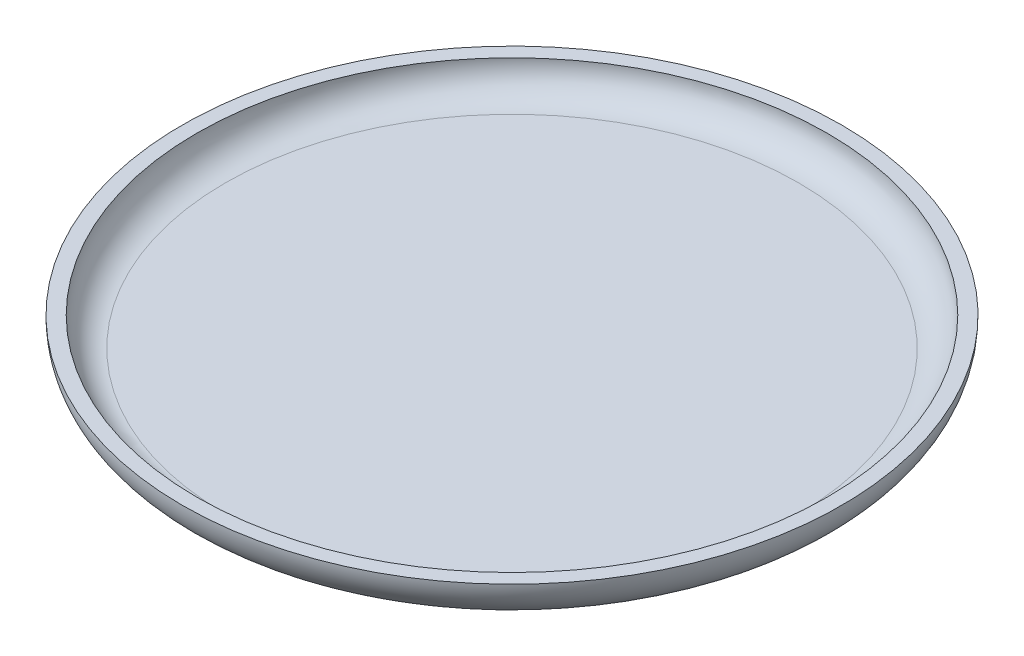
ISO-10303-21;
HEADER;
FILE_DESCRIPTION(('STEP AP214'),'2;1');
FILE_NAME('part.step','',(''),(''),'','','');
FILE_SCHEMA(('AUTOMOTIVE_DESIGN { 1 0 10303 214 1 1 1 1 }'));
ENDSEC;
DATA;
#1=APPLICATION_CONTEXT('core data for automotive mechanical design processes');
#2=APPLICATION_PROTOCOL_DEFINITION('international standard','automotive_design',2000,#1);
#3=PRODUCT_CONTEXT('',#1,'mechanical');
#4=PRODUCT('Part','Part','',(#3));
#5=PRODUCT_RELATED_PRODUCT_CATEGORY('part','',(#4));
#6=PRODUCT_DEFINITION_FORMATION('','',#4);
#7=PRODUCT_DEFINITION_CONTEXT('part definition',#1,'design');
#8=PRODUCT_DEFINITION('design','',#6,#7);
#9=PRODUCT_DEFINITION_SHAPE('','',#8);
#10=(LENGTH_UNIT() NAMED_UNIT(*) SI_UNIT(.MILLI.,.METRE.));
#11=(NAMED_UNIT(*) PLANE_ANGLE_UNIT() SI_UNIT($,.RADIAN.));
#12=(NAMED_UNIT(*) SI_UNIT($,.STERADIAN.) SOLID_ANGLE_UNIT());
#13=UNCERTAINTY_MEASURE_WITH_UNIT(LENGTH_MEASURE(1.E-05),#10,'distance_accuracy_value','');
#14=(GEOMETRIC_REPRESENTATION_CONTEXT(3) GLOBAL_UNCERTAINTY_ASSIGNED_CONTEXT((#13)) GLOBAL_UNIT_ASSIGNED_CONTEXT((#10,
#11,#12)) REPRESENTATION_CONTEXT('',''));
#15=CARTESIAN_POINT('',(0.,0.,0.));
#16=DIRECTION('',(0.,0.,1.));
#17=DIRECTION('',(1.,0.,0.));
#18=AXIS2_PLACEMENT_3D('',#15,#16,#17);
#19=CARTESIAN_POINT('',(0.,19.05,0.));
#20=DIRECTION('',(0.,-1.,0.));
#21=DIRECTION('',(0.,0.,-1.));
#22=AXIS2_PLACEMENT_3D('',#19,#20,#21);
#23=TOROIDAL_SURFACE('',#22,127.,12.7);
#24=CARTESIAN_POINT('',(0.,19.05,0.));
#25=DIRECTION('',(0.,-1.,0.));
#26=DIRECTION('',(0.,0.,-1.));
#27=AXIS2_PLACEMENT_3D('',#24,#25,#26);
#28=CIRCLE('',#27,139.7);
#29=CARTESIAN_POINT('',(0.,19.05,-139.7));
#30=VERTEX_POINT('',#29);
#31=EDGE_CURVE('E62',#30,#30,#28,.T.);
#32=ORIENTED_EDGE('',*,*,#31,.F.);
#33=EDGE_LOOP('',(#32));
#34=FACE_BOUND('',#33,.T.);
#35=CARTESIAN_POINT('',(0.,6.35,0.));
#36=DIRECTION('',(0.,-1.,0.));
#37=DIRECTION('',(0.,0.,-1.));
#38=AXIS2_PLACEMENT_3D('',#35,#36,#37);
#39=CIRCLE('',#38,127.);
#40=CARTESIAN_POINT('',(0.,6.35,-127.));
#41=VERTEX_POINT('',#40);
#42=EDGE_CURVE('E10',#41,#41,#39,.T.);
#43=ORIENTED_EDGE('',*,*,#42,.T.);
#44=EDGE_LOOP('',(#43));
#45=FACE_BOUND('',#44,.T.);
#46=ADVANCED_FACE('F45',(#34,#45),#23,.F.);
#47=CARTESIAN_POINT('',(0.,6.35,0.));
#48=DIRECTION('',(0.,-1.,0.));
#49=DIRECTION('',(0.,0.,-1.));
#50=AXIS2_PLACEMENT_3D('',#47,#48,#49);
#51=PLANE('',#50);
#52=ORIENTED_EDGE('',*,*,#42,.F.);
#53=EDGE_LOOP('',(#52));
#54=FACE_BOUND('',#53,.T.);
#55=ADVANCED_FACE('F89',(#54),#51,.F.);
#56=CARTESIAN_POINT('',(0.,0.,0.));
#57=DIRECTION('',(0.,-1.,0.));
#58=DIRECTION('',(0.,0.,-1.));
#59=AXIS2_PLACEMENT_3D('',#56,#57,#58);
#60=PLANE('',#59);
#61=CARTESIAN_POINT('',(0.,0.,0.));
#62=DIRECTION('',(0.,-1.,0.));
#63=DIRECTION('',(0.,0.,-1.));
#64=AXIS2_PLACEMENT_3D('',#61,#62,#63);
#65=CIRCLE('',#64,6.35);
#66=CARTESIAN_POINT('',(0.,0.,-6.35));
#67=VERTEX_POINT('',#66);
#68=EDGE_CURVE('E69',#67,#67,#65,.T.);
#69=ORIENTED_EDGE('',*,*,#68,.F.);
#70=EDGE_LOOP('',(#69));
#71=FACE_BOUND('',#70,.T.);
#72=CARTESIAN_POINT('',(0.,0.,0.));
#73=DIRECTION('',(0.,-1.,0.));
#74=DIRECTION('',(0.,0.,-1.));
#75=AXIS2_PLACEMENT_3D('',#72,#73,#74);
#76=CIRCLE('',#75,127.);
#77=CARTESIAN_POINT('',(0.,0.,-127.));
#78=VERTEX_POINT('',#77);
#79=EDGE_CURVE('E52',#78,#78,#76,.T.);
#80=ORIENTED_EDGE('',*,*,#79,.T.);
#81=EDGE_LOOP('',(#80));
#82=FACE_BOUND('',#81,.T.);
#83=ADVANCED_FACE('F86',(#71,#82),#60,.T.);
#84=CARTESIAN_POINT('',(0.,19.05,0.));
#85=DIRECTION('',(0.,-1.,0.));
#86=DIRECTION('',(0.,0.,-1.));
#87=AXIS2_PLACEMENT_3D('',#84,#85,#86);
#88=TOROIDAL_SURFACE('',#87,127.,19.05);
#89=CARTESIAN_POINT('',(0.,19.05,0.));
#90=DIRECTION('',(0.,-1.,0.));
#91=DIRECTION('',(0.,0.,-1.));
#92=AXIS2_PLACEMENT_3D('',#89,#90,#91);
#93=CIRCLE('',#92,146.05);
#94=CARTESIAN_POINT('',(0.,19.05,-146.05));
#95=VERTEX_POINT('',#94);
#96=EDGE_CURVE('E57',#95,#95,#93,.T.);
#97=ORIENTED_EDGE('',*,*,#96,.T.);
#98=EDGE_LOOP('',(#97));
#99=FACE_BOUND('',#98,.T.);
#100=ORIENTED_EDGE('',*,*,#79,.F.);
#101=EDGE_LOOP('',(#100));
#102=FACE_BOUND('',#101,.T.);
#103=ADVANCED_FACE('F88',(#99,#102),#88,.T.);
#104=CARTESIAN_POINT('',(0.,19.05,0.));
#105=DIRECTION('',(0.,-1.,0.));
#106=DIRECTION('',(0.,0.,-1.));
#107=AXIS2_PLACEMENT_3D('',#104,#105,#106);
#108=PLANE('',#107);
#109=ORIENTED_EDGE('',*,*,#96,.F.);
#110=EDGE_LOOP('',(#109));
#111=FACE_BOUND('',#110,.T.);
#112=ORIENTED_EDGE('',*,*,#31,.T.);
#113=EDGE_LOOP('',(#112));
#114=FACE_BOUND('',#113,.T.);
#115=ADVANCED_FACE('F82',(#111,#114),#108,.F.);
#116=CARTESIAN_POINT('',(0.,4.826,0.));
#117=DIRECTION('',(0.,-1.,0.));
#118=DIRECTION('',(0.,0.,-1.));
#119=AXIS2_PLACEMENT_3D('',#116,#117,#118);
#120=CYLINDRICAL_SURFACE('',#119,6.35);
#121=CARTESIAN_POINT('',(0.,4.826,0.));
#122=DIRECTION('',(0.,-1.,0.));
#123=DIRECTION('',(0.,0.,-1.));
#124=AXIS2_PLACEMENT_3D('',#121,#122,#123);
#125=CIRCLE('',#124,6.35);
#126=CARTESIAN_POINT('',(0.,4.826,-6.35));
#127=VERTEX_POINT('',#126);
#128=EDGE_CURVE('E68',#127,#127,#125,.T.);
#129=ORIENTED_EDGE('',*,*,#128,.F.);
#130=EDGE_LOOP('',(#129));
#131=FACE_BOUND('',#130,.T.);
#132=ORIENTED_EDGE('',*,*,#68,.T.);
#133=EDGE_LOOP('',(#132));
#134=FACE_BOUND('',#133,.T.);
#135=ADVANCED_FACE('F79',(#131,#134),#120,.F.);
#136=CARTESIAN_POINT('',(0.,4.826,0.));
#137=DIRECTION('',(0.,-1.,0.));
#138=DIRECTION('',(0.,0.,-1.));
#139=AXIS2_PLACEMENT_3D('',#136,#137,#138);
#140=PLANE('',#139);
#141=ORIENTED_EDGE('',*,*,#128,.T.);
#142=EDGE_LOOP('',(#141));
#143=FACE_BOUND('',#142,.T.);
#144=ADVANCED_FACE('F77',(#143),#140,.T.);
#145=CLOSED_SHELL('',(#46,#55,#83,#103,#115,#135,#144));
#146=MANIFOLD_SOLID_BREP('B2',#145);
#147=ADVANCED_BREP_SHAPE_REPRESENTATION('',(#18,#146),#14);
#148=SHAPE_DEFINITION_REPRESENTATION(#9,#147);
ENDSEC;
END-ISO-10303-21;
